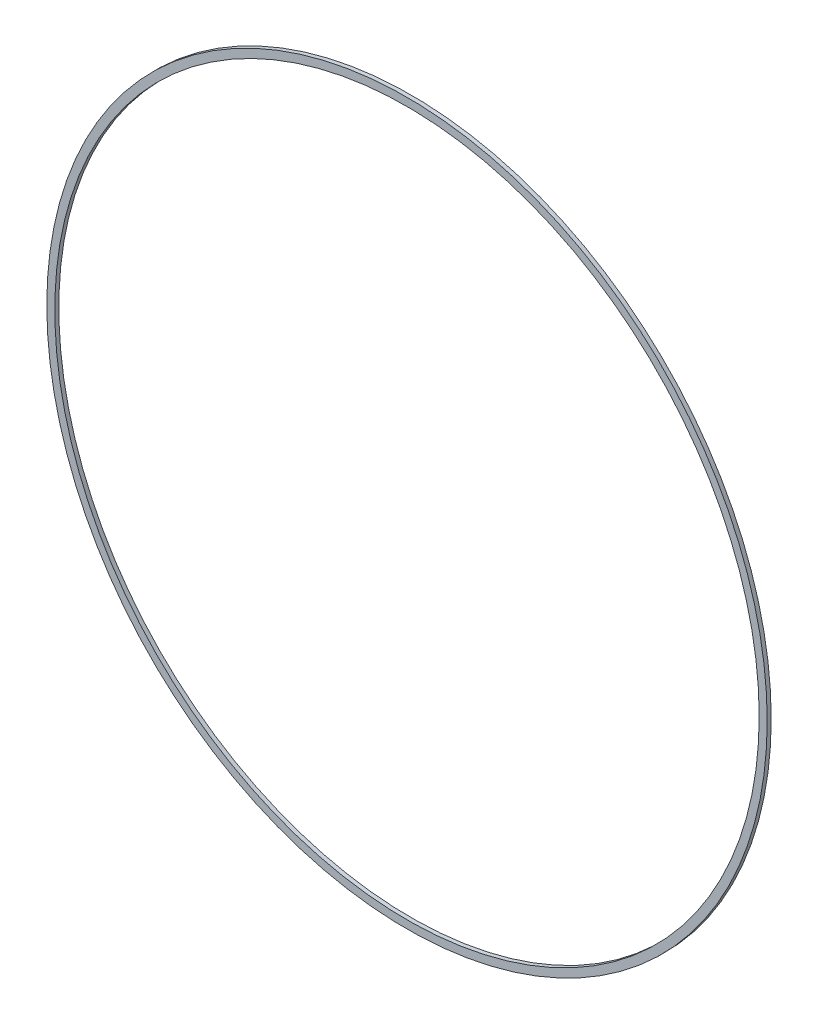
ISO-10303-21;
HEADER;
FILE_DESCRIPTION(('STEP AP214'),'2;1');
FILE_NAME('part.step','',(''),(''),'','','');
FILE_SCHEMA(('AUTOMOTIVE_DESIGN { 1 0 10303 214 1 1 1 1 }'));
ENDSEC;
DATA;
#1=APPLICATION_CONTEXT('core data for automotive mechanical design processes');
#2=APPLICATION_PROTOCOL_DEFINITION('international standard','automotive_design',2000,#1);
#3=PRODUCT_CONTEXT('',#1,'mechanical');
#4=PRODUCT('Part','Part','',(#3));
#5=PRODUCT_RELATED_PRODUCT_CATEGORY('part','',(#4));
#6=PRODUCT_DEFINITION_FORMATION('','',#4);
#7=PRODUCT_DEFINITION_CONTEXT('part definition',#1,'design');
#8=PRODUCT_DEFINITION('design','',#6,#7);
#9=PRODUCT_DEFINITION_SHAPE('','',#8);
#10=(LENGTH_UNIT() NAMED_UNIT(*) SI_UNIT(.MILLI.,.METRE.));
#11=(NAMED_UNIT(*) PLANE_ANGLE_UNIT() SI_UNIT($,.RADIAN.));
#12=(NAMED_UNIT(*) SI_UNIT($,.STERADIAN.) SOLID_ANGLE_UNIT());
#13=UNCERTAINTY_MEASURE_WITH_UNIT(LENGTH_MEASURE(1.E-05),#10,'distance_accuracy_value','');
#14=(GEOMETRIC_REPRESENTATION_CONTEXT(3) GLOBAL_UNCERTAINTY_ASSIGNED_CONTEXT((#13)) GLOBAL_UNIT_ASSIGNED_CONTEXT((#10,
#11,#12)) REPRESENTATION_CONTEXT('',''));
#15=CARTESIAN_POINT('',(0.,0.,0.));
#16=DIRECTION('',(0.,0.,1.));
#17=DIRECTION('',(1.,0.,0.));
#18=AXIS2_PLACEMENT_3D('',#15,#16,#17);
#19=CARTESIAN_POINT('',(0.,0.,1.));
#20=DIRECTION('',(0.,0.,1.));
#21=DIRECTION('',(1.,0.,0.));
#22=AXIS2_PLACEMENT_3D('',#19,#20,#21);
#23=PLANE('',#22);
#24=CARTESIAN_POINT('',(0.,0.,1.));
#25=DIRECTION('',(0.,0.,1.));
#26=DIRECTION('',(1.,0.,0.));
#27=AXIS2_PLACEMENT_3D('',#24,#25,#26);
#28=CIRCLE('',#27,90.);
#29=CARTESIAN_POINT('',(90.,0.,1.));
#30=VERTEX_POINT('',#29);
#31=EDGE_CURVE('E10',#30,#30,#28,.T.);
#32=ORIENTED_EDGE('',*,*,#31,.T.);
#33=EDGE_LOOP('',(#32));
#34=FACE_BOUND('',#33,.T.);
#35=CARTESIAN_POINT('',(0.,0.,1.));
#36=DIRECTION('',(0.,0.,1.));
#37=DIRECTION('',(1.,0.,0.));
#38=AXIS2_PLACEMENT_3D('',#35,#36,#37);
#39=CIRCLE('',#38,88.);
#40=CARTESIAN_POINT('',(88.,0.,1.));
#41=VERTEX_POINT('',#40);
#42=EDGE_CURVE('E50',#41,#41,#39,.T.);
#43=ORIENTED_EDGE('',*,*,#42,.F.);
#44=EDGE_LOOP('',(#43));
#45=FACE_BOUND('',#44,.T.);
#46=ADVANCED_FACE('F37',(#34,#45),#23,.T.);
#47=CARTESIAN_POINT('',(0.,0.,0.));
#48=DIRECTION('',(0.,0.,1.));
#49=DIRECTION('',(1.,0.,0.));
#50=AXIS2_PLACEMENT_3D('',#47,#48,#49);
#51=PLANE('',#50);
#52=CARTESIAN_POINT('',(0.,0.,0.));
#53=DIRECTION('',(0.,0.,1.));
#54=DIRECTION('',(1.,0.,0.));
#55=AXIS2_PLACEMENT_3D('',#52,#53,#54);
#56=CIRCLE('',#55,90.);
#57=CARTESIAN_POINT('',(90.,0.,0.));
#58=VERTEX_POINT('',#57);
#59=EDGE_CURVE('E41',#58,#58,#56,.T.);
#60=ORIENTED_EDGE('',*,*,#59,.F.);
#61=EDGE_LOOP('',(#60));
#62=FACE_BOUND('',#61,.T.);
#63=CARTESIAN_POINT('',(0.,0.,0.));
#64=DIRECTION('',(0.,0.,1.));
#65=DIRECTION('',(1.,0.,0.));
#66=AXIS2_PLACEMENT_3D('',#63,#64,#65);
#67=CIRCLE('',#66,88.);
#68=CARTESIAN_POINT('',(88.,0.,0.));
#69=VERTEX_POINT('',#68);
#70=EDGE_CURVE('E52',#69,#69,#67,.T.);
#71=ORIENTED_EDGE('',*,*,#70,.T.);
#72=EDGE_LOOP('',(#71));
#73=FACE_BOUND('',#72,.T.);
#74=ADVANCED_FACE('F64',(#62,#73),#51,.F.);
#75=CARTESIAN_POINT('',(0.,0.,1.));
#76=DIRECTION('',(0.,0.,-1.));
#77=DIRECTION('',(-1.,0.,0.));
#78=AXIS2_PLACEMENT_3D('',#75,#76,#77);
#79=CYLINDRICAL_SURFACE('',#78,90.);
#80=ORIENTED_EDGE('',*,*,#31,.F.);
#81=EDGE_LOOP('',(#80));
#82=FACE_BOUND('',#81,.T.);
#83=ORIENTED_EDGE('',*,*,#59,.T.);
#84=EDGE_LOOP('',(#83));
#85=FACE_BOUND('',#84,.T.);
#86=ADVANCED_FACE('F39',(#82,#85),#79,.T.);
#87=CARTESIAN_POINT('',(0.,0.,1.));
#88=DIRECTION('',(0.,0.,-1.));
#89=DIRECTION('',(-1.,0.,0.));
#90=AXIS2_PLACEMENT_3D('',#87,#88,#89);
#91=CYLINDRICAL_SURFACE('',#90,88.);
#92=ORIENTED_EDGE('',*,*,#42,.T.);
#93=EDGE_LOOP('',(#92));
#94=FACE_BOUND('',#93,.T.);
#95=ORIENTED_EDGE('',*,*,#70,.F.);
#96=EDGE_LOOP('',(#95));
#97=FACE_BOUND('',#96,.T.);
#98=ADVANCED_FACE('F60',(#94,#97),#91,.F.);
#99=CLOSED_SHELL('',(#46,#74,#86,#98));
#100=MANIFOLD_SOLID_BREP('B2',#99);
#101=ADVANCED_BREP_SHAPE_REPRESENTATION('',(#18,#100),#14);
#102=SHAPE_DEFINITION_REPRESENTATION(#9,#101);
ENDSEC;
END-ISO-10303-21;
